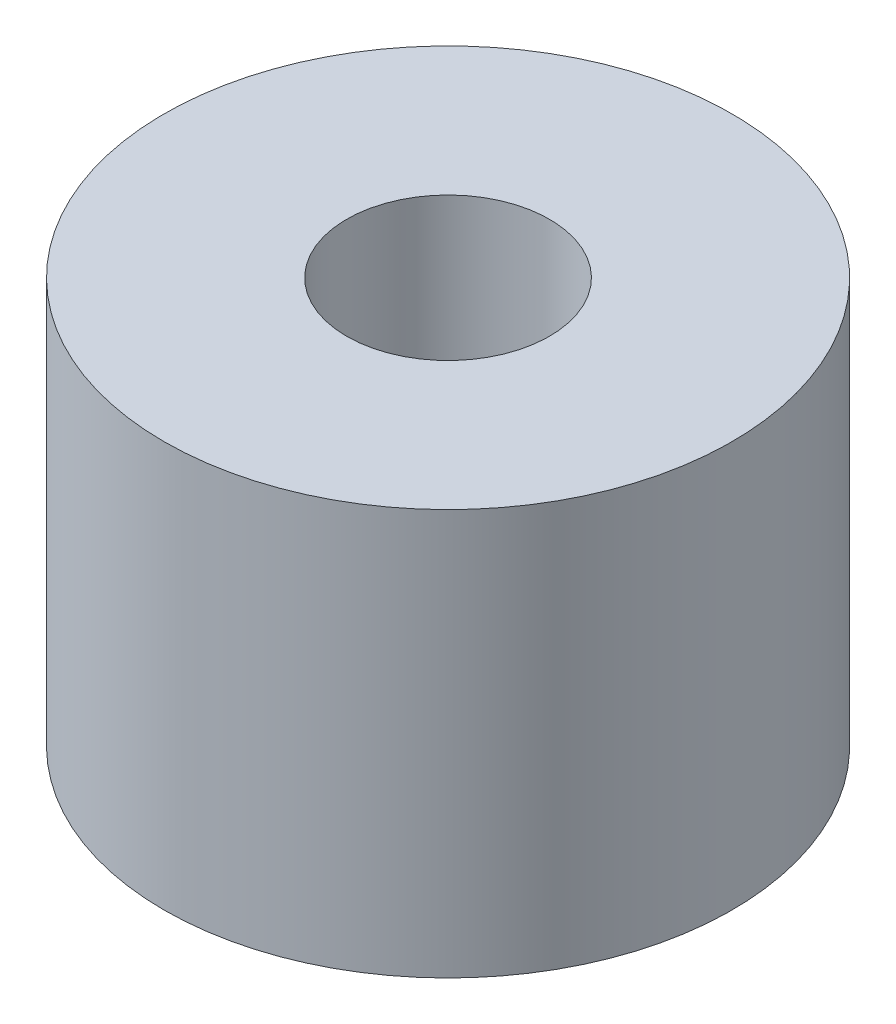
ISO-10303-21;
HEADER;
FILE_DESCRIPTION(('STEP AP214'),'2;1');
FILE_NAME('part.step','',(''),(''),'','','');
FILE_SCHEMA(('AUTOMOTIVE_DESIGN { 1 0 10303 214 1 1 1 1 }'));
ENDSEC;
DATA;
#1=APPLICATION_CONTEXT('core data for automotive mechanical design processes');
#2=APPLICATION_PROTOCOL_DEFINITION('international standard','automotive_design',2000,#1);
#3=PRODUCT_CONTEXT('',#1,'mechanical');
#4=PRODUCT('Part','Part','',(#3));
#5=PRODUCT_RELATED_PRODUCT_CATEGORY('part','',(#4));
#6=PRODUCT_DEFINITION_FORMATION('','',#4);
#7=PRODUCT_DEFINITION_CONTEXT('part definition',#1,'design');
#8=PRODUCT_DEFINITION('design','',#6,#7);
#9=PRODUCT_DEFINITION_SHAPE('','',#8);
#10=(LENGTH_UNIT() NAMED_UNIT(*) SI_UNIT(.MILLI.,.METRE.));
#11=(NAMED_UNIT(*) PLANE_ANGLE_UNIT() SI_UNIT($,.RADIAN.));
#12=(NAMED_UNIT(*) SI_UNIT($,.STERADIAN.) SOLID_ANGLE_UNIT());
#13=UNCERTAINTY_MEASURE_WITH_UNIT(LENGTH_MEASURE(1.E-05),#10,'distance_accuracy_value','');
#14=(GEOMETRIC_REPRESENTATION_CONTEXT(3) GLOBAL_UNCERTAINTY_ASSIGNED_CONTEXT((#13)) GLOBAL_UNIT_ASSIGNED_CONTEXT((#10,
#11,#12)) REPRESENTATION_CONTEXT('',''));
#15=CARTESIAN_POINT('',(0.,0.,0.));
#16=DIRECTION('',(0.,0.,1.));
#17=DIRECTION('',(1.,0.,0.));
#18=AXIS2_PLACEMENT_3D('',#15,#16,#17);
#19=CARTESIAN_POINT('',(0.,20.,0.));
#20=DIRECTION('',(0.,1.,0.));
#21=DIRECTION('',(0.,0.,1.));
#22=AXIS2_PLACEMENT_3D('',#19,#20,#21);
#23=PLANE('',#22);
#24=CARTESIAN_POINT('',(0.,20.,0.));
#25=DIRECTION('',(0.,1.,0.));
#26=DIRECTION('',(0.,0.,1.));
#27=AXIS2_PLACEMENT_3D('',#24,#25,#26);
#28=CIRCLE('',#27,14.);
#29=CARTESIAN_POINT('',(0.,20.,14.));
#30=VERTEX_POINT('',#29);
#31=EDGE_CURVE('E10',#30,#30,#28,.T.);
#32=ORIENTED_EDGE('',*,*,#31,.T.);
#33=EDGE_LOOP('',(#32));
#34=FACE_BOUND('',#33,.T.);
#35=CARTESIAN_POINT('',(0.,20.,0.));
#36=DIRECTION('',(0.,1.,0.));
#37=DIRECTION('',(0.,0.,1.));
#38=AXIS2_PLACEMENT_3D('',#35,#36,#37);
#39=CIRCLE('',#38,5.);
#40=CARTESIAN_POINT('',(0.,20.,5.));
#41=VERTEX_POINT('',#40);
#42=EDGE_CURVE('E45',#41,#41,#39,.T.);
#43=ORIENTED_EDGE('',*,*,#42,.F.);
#44=EDGE_LOOP('',(#43));
#45=FACE_BOUND('',#44,.T.);
#46=ADVANCED_FACE('F34',(#34,#45),#23,.T.);
#47=CARTESIAN_POINT('',(0.,0.,0.));
#48=DIRECTION('',(0.,1.,0.));
#49=DIRECTION('',(0.,0.,1.));
#50=AXIS2_PLACEMENT_3D('',#47,#48,#49);
#51=PLANE('',#50);
#52=CARTESIAN_POINT('',(0.,0.,0.));
#53=DIRECTION('',(0.,1.,0.));
#54=DIRECTION('',(0.,0.,1.));
#55=AXIS2_PLACEMENT_3D('',#52,#53,#54);
#56=CIRCLE('',#55,14.);
#57=CARTESIAN_POINT('',(0.,0.,14.));
#58=VERTEX_POINT('',#57);
#59=EDGE_CURVE('E38',#58,#58,#56,.T.);
#60=ORIENTED_EDGE('',*,*,#59,.F.);
#61=EDGE_LOOP('',(#60));
#62=FACE_BOUND('',#61,.T.);
#63=CARTESIAN_POINT('',(0.,0.,0.));
#64=DIRECTION('',(0.,1.,0.));
#65=DIRECTION('',(0.,0.,1.));
#66=AXIS2_PLACEMENT_3D('',#63,#64,#65);
#67=CIRCLE('',#66,5.);
#68=CARTESIAN_POINT('',(0.,0.,5.));
#69=VERTEX_POINT('',#68);
#70=EDGE_CURVE('E47',#69,#69,#67,.T.);
#71=ORIENTED_EDGE('',*,*,#70,.T.);
#72=EDGE_LOOP('',(#71));
#73=FACE_BOUND('',#72,.T.);
#74=ADVANCED_FACE('F57',(#62,#73),#51,.F.);
#75=CARTESIAN_POINT('',(0.,20.,0.));
#76=DIRECTION('',(0.,-1.,0.));
#77=DIRECTION('',(0.,0.,-1.));
#78=AXIS2_PLACEMENT_3D('',#75,#76,#77);
#79=CYLINDRICAL_SURFACE('',#78,14.);
#80=ORIENTED_EDGE('',*,*,#31,.F.);
#81=EDGE_LOOP('',(#80));
#82=FACE_BOUND('',#81,.T.);
#83=ORIENTED_EDGE('',*,*,#59,.T.);
#84=EDGE_LOOP('',(#83));
#85=FACE_BOUND('',#84,.T.);
#86=ADVANCED_FACE('F36',(#82,#85),#79,.T.);
#87=CARTESIAN_POINT('',(0.,20.,0.));
#88=DIRECTION('',(0.,-1.,0.));
#89=DIRECTION('',(0.,0.,-1.));
#90=AXIS2_PLACEMENT_3D('',#87,#88,#89);
#91=CYLINDRICAL_SURFACE('',#90,5.);
#92=ORIENTED_EDGE('',*,*,#42,.T.);
#93=EDGE_LOOP('',(#92));
#94=FACE_BOUND('',#93,.T.);
#95=ORIENTED_EDGE('',*,*,#70,.F.);
#96=EDGE_LOOP('',(#95));
#97=FACE_BOUND('',#96,.T.);
#98=ADVANCED_FACE('F53',(#94,#97),#91,.F.);
#99=CLOSED_SHELL('',(#46,#74,#86,#98));
#100=MANIFOLD_SOLID_BREP('B2',#99);
#101=ADVANCED_BREP_SHAPE_REPRESENTATION('',(#18,#100),#14);
#102=SHAPE_DEFINITION_REPRESENTATION(#9,#101);
ENDSEC;
END-ISO-10303-21;
